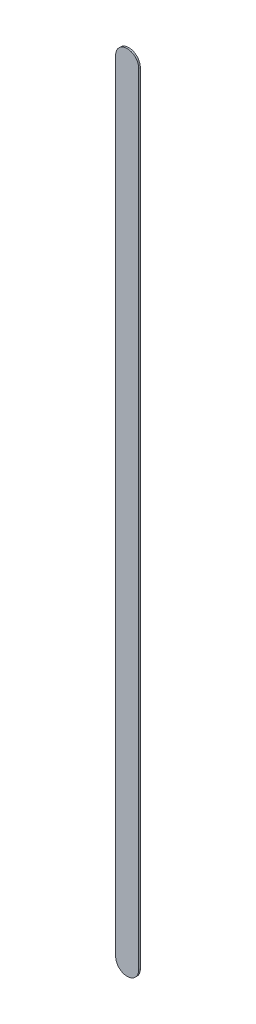
ISO-10303-21;
HEADER;
FILE_DESCRIPTION(('STEP AP214'),'2;1');
FILE_NAME('part.step','',(''),(''),'','','');
FILE_SCHEMA(('AUTOMOTIVE_DESIGN { 1 0 10303 214 1 1 1 1 }'));
ENDSEC;
DATA;
#1=APPLICATION_CONTEXT('core data for automotive mechanical design processes');
#2=APPLICATION_PROTOCOL_DEFINITION('international standard','automotive_design',2000,#1);
#3=PRODUCT_CONTEXT('',#1,'mechanical');
#4=PRODUCT('Part','Part','',(#3));
#5=PRODUCT_RELATED_PRODUCT_CATEGORY('part','',(#4));
#6=PRODUCT_DEFINITION_FORMATION('','',#4);
#7=PRODUCT_DEFINITION_CONTEXT('part definition',#1,'design');
#8=PRODUCT_DEFINITION('design','',#6,#7);
#9=PRODUCT_DEFINITION_SHAPE('','',#8);
#10=(LENGTH_UNIT() NAMED_UNIT(*) SI_UNIT(.MILLI.,.METRE.));
#11=(NAMED_UNIT(*) PLANE_ANGLE_UNIT() SI_UNIT($,.RADIAN.));
#12=(NAMED_UNIT(*) SI_UNIT($,.STERADIAN.) SOLID_ANGLE_UNIT());
#13=UNCERTAINTY_MEASURE_WITH_UNIT(LENGTH_MEASURE(1.E-05),#10,'distance_accuracy_value','');
#14=(GEOMETRIC_REPRESENTATION_CONTEXT(3) GLOBAL_UNCERTAINTY_ASSIGNED_CONTEXT((#13)) GLOBAL_UNIT_ASSIGNED_CONTEXT((#10,
#11,#12)) REPRESENTATION_CONTEXT('',''));
#15=CARTESIAN_POINT('',(0.,0.,0.));
#16=DIRECTION('',(0.,0.,1.));
#17=DIRECTION('',(1.,0.,0.));
#18=AXIS2_PLACEMENT_3D('',#15,#16,#17);
#19=CARTESIAN_POINT('',(97.40399874,80.75399902,0.));
#20=DIRECTION('',(-1.,0.,0.));
#21=DIRECTION('',(0.,1.,0.));
#22=AXIS2_PLACEMENT_3D('',#19,#20,#21);
#23=PLANE('',#22);
#24=DIRECTION('',(0.,1.,0.));
#25=VECTOR('',#24,1.);
#26=CARTESIAN_POINT('',(97.40399874,80.75399902,0.03556));
#27=LINE('',#26,#25);
#28=CARTESIAN_POINT('',(97.40399874,80.75399902,0.03556));
#29=VERTEX_POINT('',#28);
#30=CARTESIAN_POINT('',(97.40399874,97.69843808,0.03556));
#31=VERTEX_POINT('',#30);
#32=EDGE_CURVE('E11',#29,#31,#27,.T.);
#33=ORIENTED_EDGE('',*,*,#32,.F.);
#34=DIRECTION('',(0.,0.,1.));
#35=VECTOR('',#34,1.);
#36=CARTESIAN_POINT('',(97.40399874,80.75399902,0.));
#37=LINE('',#36,#35);
#38=CARTESIAN_POINT('',(97.40399874,80.75399902,0.));
#39=VERTEX_POINT('',#38);
#40=EDGE_CURVE('E24',#39,#29,#37,.T.);
#41=ORIENTED_EDGE('',*,*,#40,.F.);
#42=DIRECTION('',(0.,1.,0.));
#43=VECTOR('',#42,1.);
#44=CARTESIAN_POINT('',(97.40399874,80.75399902,0.));
#45=LINE('',#44,#43);
#46=CARTESIAN_POINT('',(97.40399874,97.69843808,0.));
#47=VERTEX_POINT('',#46);
#48=EDGE_CURVE('E75',#39,#47,#45,.T.);
#49=ORIENTED_EDGE('',*,*,#48,.T.);
#50=DIRECTION('',(0.,0.,1.));
#51=VECTOR('',#50,1.);
#52=CARTESIAN_POINT('',(97.40399874,97.69843808,0.));
#53=LINE('',#52,#51);
#54=EDGE_CURVE('E37',#47,#31,#53,.T.);
#55=ORIENTED_EDGE('',*,*,#54,.T.);
#56=EDGE_LOOP('',(#33,#41,#49,#55));
#57=FACE_BOUND('',#56,.T.);
#58=ADVANCED_FACE('F17',(#57),#23,.F.);
#59=CARTESIAN_POINT('',(97.15399924,97.69843808,0.));
#60=DIRECTION('',(0.,0.,-1.));
#61=DIRECTION('',(1.,0.,0.));
#62=AXIS2_PLACEMENT_3D('',#59,#60,#61);
#63=CYLINDRICAL_SURFACE('',#62,0.249999499999992);
#64=CARTESIAN_POINT('',(97.15399924,97.69843808,0.03556));
#65=DIRECTION('',(0.,0.,1.));
#66=DIRECTION('',(1.,0.,0.));
#67=AXIS2_PLACEMENT_3D('',#64,#65,#66);
#68=CIRCLE('',#67,0.249999499999992);
#69=CARTESIAN_POINT('',(96.90399974,97.69843808,0.03556));
#70=VERTEX_POINT('',#69);
#71=EDGE_CURVE('E83',#31,#70,#68,.T.);
#72=ORIENTED_EDGE('',*,*,#71,.F.);
#73=ORIENTED_EDGE('',*,*,#54,.F.);
#74=CARTESIAN_POINT('',(97.15399924,97.69843808,0.));
#75=DIRECTION('',(0.,0.,1.));
#76=DIRECTION('',(1.,0.,0.));
#77=AXIS2_PLACEMENT_3D('',#74,#75,#76);
#78=CIRCLE('',#77,0.249999499999992);
#79=CARTESIAN_POINT('',(96.90399974,97.69843808,0.));
#80=VERTEX_POINT('',#79);
#81=EDGE_CURVE('E81',#47,#80,#78,.T.);
#82=ORIENTED_EDGE('',*,*,#81,.T.);
#83=DIRECTION('',(0.,0.,1.));
#84=VECTOR('',#83,1.);
#85=CARTESIAN_POINT('',(96.90399974,97.69843808,0.));
#86=LINE('',#85,#84);
#87=EDGE_CURVE('E67',#80,#70,#86,.T.);
#88=ORIENTED_EDGE('',*,*,#87,.T.);
#89=EDGE_LOOP('',(#72,#73,#82,#88));
#90=FACE_BOUND('',#89,.T.);
#91=ADVANCED_FACE('F89',(#90),#63,.T.);
#92=CARTESIAN_POINT('',(96.90399974,97.69843808,0.));
#93=DIRECTION('',(1.,0.,0.));
#94=DIRECTION('',(0.,-1.,0.));
#95=AXIS2_PLACEMENT_3D('',#92,#93,#94);
#96=PLANE('',#95);
#97=DIRECTION('',(0.,-1.,0.));
#98=VECTOR('',#97,1.);
#99=CARTESIAN_POINT('',(96.90399974,97.69843808,0.03556));
#100=LINE('',#99,#98);
#101=CARTESIAN_POINT('',(96.90399974,80.75399902,0.03556));
#102=VERTEX_POINT('',#101);
#103=EDGE_CURVE('E71',#70,#102,#100,.T.);
#104=ORIENTED_EDGE('',*,*,#103,.F.);
#105=ORIENTED_EDGE('',*,*,#87,.F.);
#106=DIRECTION('',(0.,-1.,0.));
#107=VECTOR('',#106,1.);
#108=CARTESIAN_POINT('',(96.90399974,97.69843808,0.));
#109=LINE('',#108,#107);
#110=CARTESIAN_POINT('',(96.90399974,80.75399902,0.));
#111=VERTEX_POINT('',#110);
#112=EDGE_CURVE('E63',#80,#111,#109,.T.);
#113=ORIENTED_EDGE('',*,*,#112,.T.);
#114=DIRECTION('',(0.,0.,1.));
#115=VECTOR('',#114,1.);
#116=CARTESIAN_POINT('',(96.90399974,80.75399902,0.));
#117=LINE('',#116,#115);
#118=EDGE_CURVE('E53',#111,#102,#117,.T.);
#119=ORIENTED_EDGE('',*,*,#118,.T.);
#120=EDGE_LOOP('',(#104,#105,#113,#119));
#121=FACE_BOUND('',#120,.T.);
#122=ADVANCED_FACE('F66',(#121),#96,.F.);
#123=CARTESIAN_POINT('',(97.15399924,80.75399902,0.));
#124=DIRECTION('',(0.,0.,-1.));
#125=DIRECTION('',(-1.,0.,0.));
#126=AXIS2_PLACEMENT_3D('',#123,#124,#125);
#127=CYLINDRICAL_SURFACE('',#126,0.249999499999992);
#128=CARTESIAN_POINT('',(97.15399924,80.75399902,0.03556));
#129=DIRECTION('',(0.,0.,1.));
#130=DIRECTION('',(-1.,0.,0.));
#131=AXIS2_PLACEMENT_3D('',#128,#129,#130);
#132=CIRCLE('',#131,0.249999499999992);
#133=EDGE_CURVE('E59',#102,#29,#132,.T.);
#134=ORIENTED_EDGE('',*,*,#133,.F.);
#135=ORIENTED_EDGE('',*,*,#118,.F.);
#136=CARTESIAN_POINT('',(97.15399924,80.75399902,0.));
#137=DIRECTION('',(0.,0.,1.));
#138=DIRECTION('',(-1.,0.,0.));
#139=AXIS2_PLACEMENT_3D('',#136,#137,#138);
#140=CIRCLE('',#139,0.249999499999992);
#141=EDGE_CURVE('E57',#111,#39,#140,.T.);
#142=ORIENTED_EDGE('',*,*,#141,.T.);
#143=ORIENTED_EDGE('',*,*,#40,.T.);
#144=EDGE_LOOP('',(#134,#135,#142,#143));
#145=FACE_BOUND('',#144,.T.);
#146=ADVANCED_FACE('F55',(#145),#127,.T.);
#147=CARTESIAN_POINT('',(97.40399874,80.75399902,0.));
#148=DIRECTION('',(0.,0.,-1.));
#149=DIRECTION('',(-1.,0.,0.));
#150=AXIS2_PLACEMENT_3D('',#147,#148,#149);
#151=PLANE('',#150);
#152=ORIENTED_EDGE('',*,*,#141,.F.);
#153=ORIENTED_EDGE('',*,*,#112,.F.);
#154=ORIENTED_EDGE('',*,*,#81,.F.);
#155=ORIENTED_EDGE('',*,*,#48,.F.);
#156=EDGE_LOOP('',(#152,#153,#154,#155));
#157=FACE_BOUND('',#156,.T.);
#158=ADVANCED_FACE('F74',(#157),#151,.T.);
#159=CARTESIAN_POINT('',(97.40399874,80.75399902,0.03556));
#160=DIRECTION('',(0.,0.,-1.));
#161=DIRECTION('',(-1.,0.,0.));
#162=AXIS2_PLACEMENT_3D('',#159,#160,#161);
#163=PLANE('',#162);
#164=ORIENTED_EDGE('',*,*,#32,.T.);
#165=ORIENTED_EDGE('',*,*,#71,.T.);
#166=ORIENTED_EDGE('',*,*,#103,.T.);
#167=ORIENTED_EDGE('',*,*,#133,.T.);
#168=EDGE_LOOP('',(#164,#165,#166,#167));
#169=FACE_BOUND('',#168,.T.);
#170=ADVANCED_FACE('F91',(#169),#163,.F.);
#171=CLOSED_SHELL('',(#58,#91,#122,#146,#158,#170));
#172=MANIFOLD_SOLID_BREP('B1',#171);
#173=ADVANCED_BREP_SHAPE_REPRESENTATION('',(#18,#172),#14);
#174=SHAPE_DEFINITION_REPRESENTATION(#9,#173);
ENDSEC;
END-ISO-10303-21;
